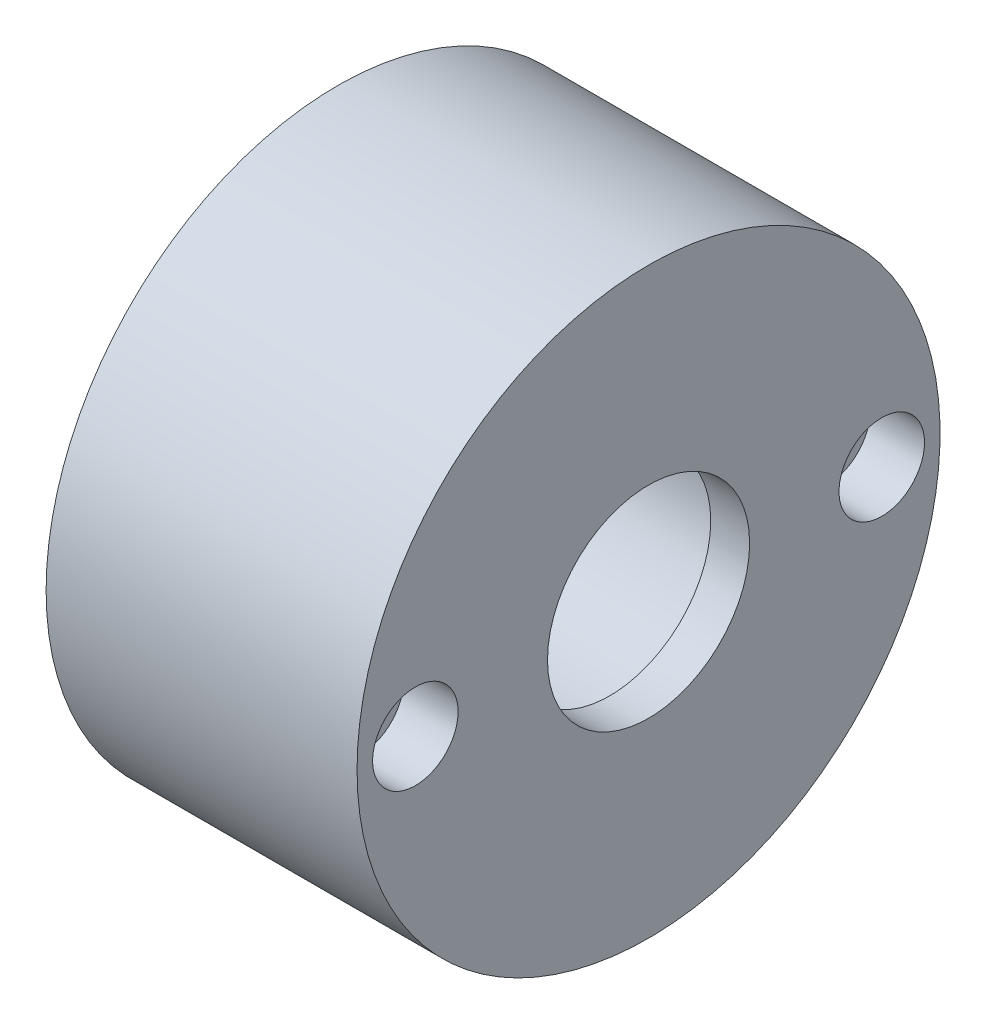
ISO-10303-21;
HEADER;
FILE_DESCRIPTION(('STEP AP214'),'2;1');
FILE_NAME('part.step','',(''),(''),'','','');
FILE_SCHEMA(('AUTOMOTIVE_DESIGN { 1 0 10303 214 1 1 1 1 }'));
ENDSEC;
DATA;
#1=APPLICATION_CONTEXT('core data for automotive mechanical design processes');
#2=APPLICATION_PROTOCOL_DEFINITION('international standard','automotive_design',2000,#1);
#3=PRODUCT_CONTEXT('',#1,'mechanical');
#4=PRODUCT('Part','Part','',(#3));
#5=PRODUCT_RELATED_PRODUCT_CATEGORY('part','',(#4));
#6=PRODUCT_DEFINITION_FORMATION('','',#4);
#7=PRODUCT_DEFINITION_CONTEXT('part definition',#1,'design');
#8=PRODUCT_DEFINITION('design','',#6,#7);
#9=PRODUCT_DEFINITION_SHAPE('','',#8);
#10=(LENGTH_UNIT() NAMED_UNIT(*) SI_UNIT(.MILLI.,.METRE.));
#11=(NAMED_UNIT(*) PLANE_ANGLE_UNIT() SI_UNIT($,.RADIAN.));
#12=(NAMED_UNIT(*) SI_UNIT($,.STERADIAN.) SOLID_ANGLE_UNIT());
#13=UNCERTAINTY_MEASURE_WITH_UNIT(LENGTH_MEASURE(1.E-05),#10,'distance_accuracy_value','');
#14=(GEOMETRIC_REPRESENTATION_CONTEXT(3) GLOBAL_UNCERTAINTY_ASSIGNED_CONTEXT((#13)) GLOBAL_UNIT_ASSIGNED_CONTEXT((#10,
#11,#12)) REPRESENTATION_CONTEXT('',''));
#15=CARTESIAN_POINT('',(0.,0.,0.));
#16=DIRECTION('',(0.,0.,1.));
#17=DIRECTION('',(1.,0.,0.));
#18=AXIS2_PLACEMENT_3D('',#15,#16,#17);
#19=CARTESIAN_POINT('',(-40.,0.,30.));
#20=DIRECTION('',(1.,0.,0.));
#21=DIRECTION('',(0.,0.,-1.));
#22=AXIS2_PLACEMENT_3D('',#19,#20,#21);
#23=CYLINDRICAL_SURFACE('',#22,4.);
#24=CARTESIAN_POINT('',(-40.,0.,30.));
#25=DIRECTION('',(1.,0.,0.));
#26=DIRECTION('',(0.,0.,-1.));
#27=AXIS2_PLACEMENT_3D('',#24,#25,#26);
#28=CIRCLE('',#27,4.);
#29=CARTESIAN_POINT('',(-40.,0.,26.));
#30=VERTEX_POINT('',#29);
#31=EDGE_CURVE('E59',#30,#30,#28,.T.);
#32=ORIENTED_EDGE('',*,*,#31,.F.);
#33=EDGE_LOOP('',(#32));
#34=FACE_BOUND('',#33,.T.);
#35=CARTESIAN_POINT('',(-7.,0.,30.));
#36=DIRECTION('',(1.,0.,0.));
#37=DIRECTION('',(0.,0.,-1.));
#38=AXIS2_PLACEMENT_3D('',#35,#36,#37);
#39=CIRCLE('',#38,4.);
#40=CARTESIAN_POINT('',(-7.,0.,26.));
#41=VERTEX_POINT('',#40);
#42=EDGE_CURVE('E41',#41,#41,#39,.F.);
#43=ORIENTED_EDGE('',*,*,#42,.F.);
#44=EDGE_LOOP('',(#43));
#45=FACE_BOUND('',#44,.T.);
#46=ADVANCED_FACE('F37',(#34,#45),#23,.F.);
#47=CARTESIAN_POINT('',(-40.,0.,-30.));
#48=DIRECTION('',(1.,0.,0.));
#49=DIRECTION('',(0.,0.,-1.));
#50=AXIS2_PLACEMENT_3D('',#47,#48,#49);
#51=CYLINDRICAL_SURFACE('',#50,4.);
#52=CARTESIAN_POINT('',(-40.,0.,-30.));
#53=DIRECTION('',(1.,0.,0.));
#54=DIRECTION('',(0.,0.,-1.));
#55=AXIS2_PLACEMENT_3D('',#52,#53,#54);
#56=CIRCLE('',#55,4.);
#57=CARTESIAN_POINT('',(-40.,0.,-34.));
#58=VERTEX_POINT('',#57);
#59=EDGE_CURVE('E74',#58,#58,#56,.T.);
#60=ORIENTED_EDGE('',*,*,#59,.F.);
#61=EDGE_LOOP('',(#60));
#62=FACE_BOUND('',#61,.T.);
#63=CARTESIAN_POINT('',(-7.,0.,-30.));
#64=DIRECTION('',(1.,0.,0.));
#65=DIRECTION('',(0.,0.,-1.));
#66=AXIS2_PLACEMENT_3D('',#63,#64,#65);
#67=CIRCLE('',#66,4.);
#68=CARTESIAN_POINT('',(-7.,0.,-34.));
#69=VERTEX_POINT('',#68);
#70=EDGE_CURVE('E53',#69,#69,#67,.F.);
#71=ORIENTED_EDGE('',*,*,#70,.F.);
#72=EDGE_LOOP('',(#71));
#73=FACE_BOUND('',#72,.T.);
#74=ADVANCED_FACE('F103',(#62,#73),#51,.F.);
#75=CARTESIAN_POINT('',(-40.,37.5,0.));
#76=DIRECTION('',(1.,0.,0.));
#77=DIRECTION('',(0.,0.,-1.));
#78=AXIS2_PLACEMENT_3D('',#75,#76,#77);
#79=PLANE('',#78);
#80=ORIENTED_EDGE('',*,*,#59,.T.);
#81=EDGE_LOOP('',(#80));
#82=FACE_BOUND('',#81,.T.);
#83=ORIENTED_EDGE('',*,*,#31,.T.);
#84=EDGE_LOOP('',(#83));
#85=FACE_BOUND('',#84,.T.);
#86=CARTESIAN_POINT('',(-40.,0.,0.));
#87=DIRECTION('',(-1.,0.,0.));
#88=DIRECTION('',(0.,0.,1.));
#89=AXIS2_PLACEMENT_3D('',#86,#87,#88);
#90=CIRCLE('',#89,16.5);
#91=CARTESIAN_POINT('',(-40.,0.,16.5));
#92=VERTEX_POINT('',#91);
#93=EDGE_CURVE('E10',#92,#92,#90,.T.);
#94=ORIENTED_EDGE('',*,*,#93,.F.);
#95=EDGE_LOOP('',(#94));
#96=FACE_BOUND('',#95,.T.);
#97=CARTESIAN_POINT('',(-40.,0.,0.));
#98=DIRECTION('',(-1.,0.,0.));
#99=DIRECTION('',(0.,0.,1.));
#100=AXIS2_PLACEMENT_3D('',#97,#98,#99);
#101=CIRCLE('',#100,37.5);
#102=CARTESIAN_POINT('',(-40.,0.,37.5));
#103=VERTEX_POINT('',#102);
#104=EDGE_CURVE('E77',#103,#103,#101,.T.);
#105=ORIENTED_EDGE('',*,*,#104,.T.);
#106=EDGE_LOOP('',(#105));
#107=FACE_BOUND('',#106,.T.);
#108=ADVANCED_FACE('F39',(#82,#85,#96,#107),#79,.F.);
#109=CARTESIAN_POINT('',(-40.,0.,0.));
#110=DIRECTION('',(-1.,0.,0.));
#111=DIRECTION('',(0.,0.,1.));
#112=AXIS2_PLACEMENT_3D('',#109,#110,#111);
#113=CYLINDRICAL_SURFACE('',#112,16.5);
#114=CARTESIAN_POINT('',(-5.,0.,0.));
#115=DIRECTION('',(-1.,0.,0.));
#116=DIRECTION('',(0.,0.,1.));
#117=AXIS2_PLACEMENT_3D('',#114,#115,#116);
#118=CIRCLE('',#117,16.5);
#119=CARTESIAN_POINT('',(-5.,0.,16.5));
#120=VERTEX_POINT('',#119);
#121=EDGE_CURVE('E45',#120,#120,#118,.T.);
#122=ORIENTED_EDGE('',*,*,#121,.F.);
#123=EDGE_LOOP('',(#122));
#124=FACE_BOUND('',#123,.T.);
#125=ORIENTED_EDGE('',*,*,#93,.T.);
#126=EDGE_LOOP('',(#125));
#127=FACE_BOUND('',#126,.T.);
#128=ADVANCED_FACE('F95',(#124,#127),#113,.F.);
#129=CARTESIAN_POINT('',(-5.,16.5,0.));
#130=DIRECTION('',(1.,0.,0.));
#131=DIRECTION('',(0.,0.,-1.));
#132=AXIS2_PLACEMENT_3D('',#129,#130,#131);
#133=PLANE('',#132);
#134=CARTESIAN_POINT('',(-5.,0.,0.));
#135=DIRECTION('',(-1.,0.,0.));
#136=DIRECTION('',(0.,0.,1.));
#137=AXIS2_PLACEMENT_3D('',#134,#135,#136);
#138=CIRCLE('',#137,13.);
#139=CARTESIAN_POINT('',(-5.,0.,13.));
#140=VERTEX_POINT('',#139);
#141=EDGE_CURVE('E50',#140,#140,#138,.T.);
#142=ORIENTED_EDGE('',*,*,#141,.F.);
#143=EDGE_LOOP('',(#142));
#144=FACE_BOUND('',#143,.T.);
#145=ORIENTED_EDGE('',*,*,#121,.T.);
#146=EDGE_LOOP('',(#145));
#147=FACE_BOUND('',#146,.T.);
#148=ADVANCED_FACE('F92',(#144,#147),#133,.F.);
#149=CARTESIAN_POINT('',(-40.,0.,0.));
#150=DIRECTION('',(-1.,0.,0.));
#151=DIRECTION('',(0.,0.,1.));
#152=AXIS2_PLACEMENT_3D('',#149,#150,#151);
#153=CYLINDRICAL_SURFACE('',#152,13.);
#154=CARTESIAN_POINT('',(0.,0.,0.));
#155=DIRECTION('',(-1.,0.,0.));
#156=DIRECTION('',(0.,0.,1.));
#157=AXIS2_PLACEMENT_3D('',#154,#155,#156);
#158=CIRCLE('',#157,13.);
#159=CARTESIAN_POINT('',(0.,0.,13.));
#160=VERTEX_POINT('',#159);
#161=EDGE_CURVE('E85',#160,#160,#158,.T.);
#162=ORIENTED_EDGE('',*,*,#161,.F.);
#163=EDGE_LOOP('',(#162));
#164=FACE_BOUND('',#163,.T.);
#165=ORIENTED_EDGE('',*,*,#141,.T.);
#166=EDGE_LOOP('',(#165));
#167=FACE_BOUND('',#166,.T.);
#168=ADVANCED_FACE('F90',(#164,#167),#153,.F.);
#169=CARTESIAN_POINT('',(0.,13.,0.));
#170=DIRECTION('',(-1.,0.,0.));
#171=DIRECTION('',(0.,0.,1.));
#172=AXIS2_PLACEMENT_3D('',#169,#170,#171);
#173=PLANE('',#172);
#174=CARTESIAN_POINT('',(0.,0.,-30.));
#175=DIRECTION('',(1.,0.,0.));
#176=DIRECTION('',(0.,0.,-1.));
#177=AXIS2_PLACEMENT_3D('',#174,#175,#176);
#178=CIRCLE('',#177,5.5);
#179=CARTESIAN_POINT('',(0.,0.,-35.5));
#180=VERTEX_POINT('',#179);
#181=EDGE_CURVE('E61',#180,#180,#178,.T.);
#182=ORIENTED_EDGE('',*,*,#181,.F.);
#183=EDGE_LOOP('',(#182));
#184=FACE_BOUND('',#183,.T.);
#185=CARTESIAN_POINT('',(0.,0.,30.));
#186=DIRECTION('',(1.,0.,0.));
#187=DIRECTION('',(0.,0.,-1.));
#188=AXIS2_PLACEMENT_3D('',#185,#186,#187);
#189=CIRCLE('',#188,5.5);
#190=CARTESIAN_POINT('',(0.,0.,24.5));
#191=VERTEX_POINT('',#190);
#192=EDGE_CURVE('E66',#191,#191,#189,.T.);
#193=ORIENTED_EDGE('',*,*,#192,.F.);
#194=EDGE_LOOP('',(#193));
#195=FACE_BOUND('',#194,.T.);
#196=CARTESIAN_POINT('',(0.,0.,0.));
#197=DIRECTION('',(-1.,0.,0.));
#198=DIRECTION('',(0.,0.,1.));
#199=AXIS2_PLACEMENT_3D('',#196,#197,#198);
#200=CIRCLE('',#199,37.5);
#201=CARTESIAN_POINT('',(0.,0.,37.5));
#202=VERTEX_POINT('',#201);
#203=EDGE_CURVE('E82',#202,#202,#200,.T.);
#204=ORIENTED_EDGE('',*,*,#203,.F.);
#205=EDGE_LOOP('',(#204));
#206=FACE_BOUND('',#205,.T.);
#207=ORIENTED_EDGE('',*,*,#161,.T.);
#208=EDGE_LOOP('',(#207));
#209=FACE_BOUND('',#208,.T.);
#210=ADVANCED_FACE('F121',(#184,#195,#206,#209),#173,.F.);
#211=CARTESIAN_POINT('',(-40.,0.,0.));
#212=DIRECTION('',(-1.,0.,0.));
#213=DIRECTION('',(0.,0.,1.));
#214=AXIS2_PLACEMENT_3D('',#211,#212,#213);
#215=CYLINDRICAL_SURFACE('',#214,37.5);
#216=ORIENTED_EDGE('',*,*,#104,.F.);
#217=EDGE_LOOP('',(#216));
#218=FACE_BOUND('',#217,.T.);
#219=ORIENTED_EDGE('',*,*,#203,.T.);
#220=EDGE_LOOP('',(#219));
#221=FACE_BOUND('',#220,.T.);
#222=ADVANCED_FACE('F117',(#218,#221),#215,.T.);
#223=CARTESIAN_POINT('',(-7.,0.,-30.));
#224=DIRECTION('',(1.,0.,0.));
#225=DIRECTION('',(0.,0.,-1.));
#226=AXIS2_PLACEMENT_3D('',#223,#224,#225);
#227=PLANE('',#226);
#228=CARTESIAN_POINT('',(-7.,0.,-30.));
#229=DIRECTION('',(1.,0.,0.));
#230=DIRECTION('',(0.,0.,-1.));
#231=AXIS2_PLACEMENT_3D('',#228,#229,#230);
#232=CIRCLE('',#231,5.5);
#233=CARTESIAN_POINT('',(-7.,0.,-35.5));
#234=VERTEX_POINT('',#233);
#235=EDGE_CURVE('E55',#234,#234,#232,.T.);
#236=ORIENTED_EDGE('',*,*,#235,.T.);
#237=EDGE_LOOP('',(#236));
#238=FACE_BOUND('',#237,.T.);
#239=ORIENTED_EDGE('',*,*,#70,.T.);
#240=EDGE_LOOP('',(#239));
#241=FACE_BOUND('',#240,.T.);
#242=ADVANCED_FACE('F120',(#238,#241),#227,.T.);
#243=CARTESIAN_POINT('',(-7.,0.,-30.));
#244=DIRECTION('',(1.,0.,0.));
#245=DIRECTION('',(0.,0.,-1.));
#246=AXIS2_PLACEMENT_3D('',#243,#244,#245);
#247=CYLINDRICAL_SURFACE('',#246,5.5);
#248=ORIENTED_EDGE('',*,*,#235,.F.);
#249=EDGE_LOOP('',(#248));
#250=FACE_BOUND('',#249,.T.);
#251=ORIENTED_EDGE('',*,*,#181,.T.);
#252=EDGE_LOOP('',(#251));
#253=FACE_BOUND('',#252,.T.);
#254=ADVANCED_FACE('F150',(#250,#253),#247,.F.);
#255=CARTESIAN_POINT('',(-7.,0.,30.));
#256=DIRECTION('',(1.,0.,0.));
#257=DIRECTION('',(0.,0.,-1.));
#258=AXIS2_PLACEMENT_3D('',#255,#256,#257);
#259=PLANE('',#258);
#260=CARTESIAN_POINT('',(-7.,0.,30.));
#261=DIRECTION('',(1.,0.,0.));
#262=DIRECTION('',(0.,0.,-1.));
#263=AXIS2_PLACEMENT_3D('',#260,#261,#262);
#264=CIRCLE('',#263,5.5);
#265=CARTESIAN_POINT('',(-7.,0.,24.5));
#266=VERTEX_POINT('',#265);
#267=EDGE_CURVE('E71',#266,#266,#264,.T.);
#268=ORIENTED_EDGE('',*,*,#267,.T.);
#269=EDGE_LOOP('',(#268));
#270=FACE_BOUND('',#269,.T.);
#271=ORIENTED_EDGE('',*,*,#42,.T.);
#272=EDGE_LOOP('',(#271));
#273=FACE_BOUND('',#272,.T.);
#274=ADVANCED_FACE('F157',(#270,#273),#259,.T.);
#275=CARTESIAN_POINT('',(-7.,0.,30.));
#276=DIRECTION('',(1.,0.,0.));
#277=DIRECTION('',(0.,0.,-1.));
#278=AXIS2_PLACEMENT_3D('',#275,#276,#277);
#279=CYLINDRICAL_SURFACE('',#278,5.5);
#280=ORIENTED_EDGE('',*,*,#267,.F.);
#281=EDGE_LOOP('',(#280));
#282=FACE_BOUND('',#281,.T.);
#283=ORIENTED_EDGE('',*,*,#192,.T.);
#284=EDGE_LOOP('',(#283));
#285=FACE_BOUND('',#284,.T.);
#286=ADVANCED_FACE('F165',(#282,#285),#279,.F.);
#287=CLOSED_SHELL('',(#46,#74,#108,#128,#148,#168,#210,#222,#242,#254,#274,#286));
#288=MANIFOLD_SOLID_BREP('B2',#287);
#289=ADVANCED_BREP_SHAPE_REPRESENTATION('',(#18,#288),#14);
#290=SHAPE_DEFINITION_REPRESENTATION(#9,#289);
ENDSEC;
END-ISO-10303-21;
